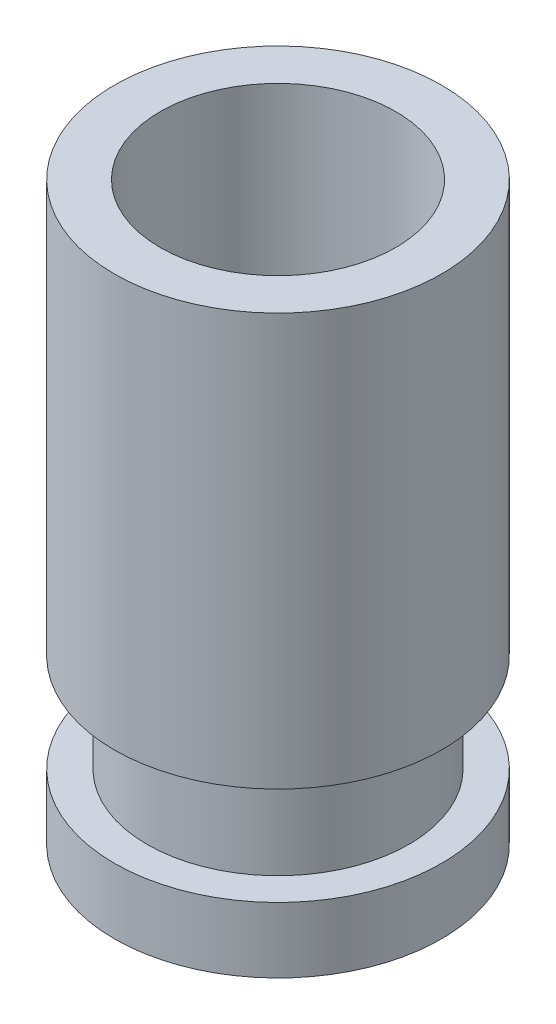
ISO-10303-21;
HEADER;
FILE_DESCRIPTION(('STEP AP214'),'2;1');
FILE_NAME('part.step','',(''),(''),'','','');
FILE_SCHEMA(('AUTOMOTIVE_DESIGN { 1 0 10303 214 1 1 1 1 }'));
ENDSEC;
DATA;
#1=APPLICATION_CONTEXT('core data for automotive mechanical design processes');
#2=APPLICATION_PROTOCOL_DEFINITION('international standard','automotive_design',2000,#1);
#3=PRODUCT_CONTEXT('',#1,'mechanical');
#4=PRODUCT('Part','Part','',(#3));
#5=PRODUCT_RELATED_PRODUCT_CATEGORY('part','',(#4));
#6=PRODUCT_DEFINITION_FORMATION('','',#4);
#7=PRODUCT_DEFINITION_CONTEXT('part definition',#1,'design');
#8=PRODUCT_DEFINITION('design','',#6,#7);
#9=PRODUCT_DEFINITION_SHAPE('','',#8);
#10=(LENGTH_UNIT() NAMED_UNIT(*) SI_UNIT(.MILLI.,.METRE.));
#11=(NAMED_UNIT(*) PLANE_ANGLE_UNIT() SI_UNIT($,.RADIAN.));
#12=(NAMED_UNIT(*) SI_UNIT($,.STERADIAN.) SOLID_ANGLE_UNIT());
#13=UNCERTAINTY_MEASURE_WITH_UNIT(LENGTH_MEASURE(1.E-05),#10,'distance_accuracy_value','');
#14=(GEOMETRIC_REPRESENTATION_CONTEXT(3) GLOBAL_UNCERTAINTY_ASSIGNED_CONTEXT((#13)) GLOBAL_UNIT_ASSIGNED_CONTEXT((#10,
#11,#12)) REPRESENTATION_CONTEXT('',''));
#15=CARTESIAN_POINT('',(0.,0.,0.));
#16=DIRECTION('',(0.,0.,1.));
#17=DIRECTION('',(1.,0.,0.));
#18=AXIS2_PLACEMENT_3D('',#15,#16,#17);
#19=CARTESIAN_POINT('',(0.,10.,0.));
#20=DIRECTION('',(0.,1.,0.));
#21=DIRECTION('',(0.,0.,1.));
#22=AXIS2_PLACEMENT_3D('',#19,#20,#21);
#23=PLANE('',#22);
#24=CARTESIAN_POINT('',(0.,10.,0.));
#25=DIRECTION('',(0.,1.,0.));
#26=DIRECTION('',(0.,0.,1.));
#27=AXIS2_PLACEMENT_3D('',#24,#25,#26);
#28=CIRCLE('',#27,25.);
#29=CARTESIAN_POINT('',(0.,10.,25.));
#30=VERTEX_POINT('',#29);
#31=EDGE_CURVE('E10',#30,#30,#28,.T.);
#32=ORIENTED_EDGE('',*,*,#31,.T.);
#33=EDGE_LOOP('',(#32));
#34=FACE_BOUND('',#33,.T.);
#35=CARTESIAN_POINT('',(0.,10.,0.));
#36=DIRECTION('',(0.,1.,0.));
#37=DIRECTION('',(0.,0.,1.));
#38=AXIS2_PLACEMENT_3D('',#35,#36,#37);
#39=CIRCLE('',#38,20.);
#40=CARTESIAN_POINT('',(0.,10.,20.));
#41=VERTEX_POINT('',#40);
#42=EDGE_CURVE('E47',#41,#41,#39,.T.);
#43=ORIENTED_EDGE('',*,*,#42,.F.);
#44=EDGE_LOOP('',(#43));
#45=FACE_BOUND('',#44,.T.);
#46=ADVANCED_FACE('F31',(#34,#45),#23,.T.);
#47=CARTESIAN_POINT('',(0.,0.,0.));
#48=DIRECTION('',(0.,1.,0.));
#49=DIRECTION('',(0.,0.,1.));
#50=AXIS2_PLACEMENT_3D('',#47,#48,#49);
#51=PLANE('',#50);
#52=CARTESIAN_POINT('',(0.,0.,0.));
#53=DIRECTION('',(0.,1.,0.));
#54=DIRECTION('',(0.,0.,1.));
#55=AXIS2_PLACEMENT_3D('',#52,#53,#54);
#56=CIRCLE('',#55,25.);
#57=CARTESIAN_POINT('',(0.,0.,25.));
#58=VERTEX_POINT('',#57);
#59=EDGE_CURVE('E35',#58,#58,#56,.T.);
#60=ORIENTED_EDGE('',*,*,#59,.F.);
#61=EDGE_LOOP('',(#60));
#62=FACE_BOUND('',#61,.T.);
#63=CARTESIAN_POINT('',(0.,0.,0.));
#64=DIRECTION('',(0.,1.,0.));
#65=DIRECTION('',(0.,0.,1.));
#66=AXIS2_PLACEMENT_3D('',#63,#64,#65);
#67=CIRCLE('',#66,18.);
#68=CARTESIAN_POINT('',(0.,0.,18.));
#69=VERTEX_POINT('',#68);
#70=EDGE_CURVE('E42',#69,#69,#67,.T.);
#71=ORIENTED_EDGE('',*,*,#70,.T.);
#72=EDGE_LOOP('',(#71));
#73=FACE_BOUND('',#72,.T.);
#74=ADVANCED_FACE('F80',(#62,#73),#51,.F.);
#75=CARTESIAN_POINT('',(0.,10.,0.));
#76=DIRECTION('',(0.,-1.,0.));
#77=DIRECTION('',(0.,0.,-1.));
#78=AXIS2_PLACEMENT_3D('',#75,#76,#77);
#79=CYLINDRICAL_SURFACE('',#78,25.);
#80=ORIENTED_EDGE('',*,*,#31,.F.);
#81=EDGE_LOOP('',(#80));
#82=FACE_BOUND('',#81,.T.);
#83=ORIENTED_EDGE('',*,*,#59,.T.);
#84=EDGE_LOOP('',(#83));
#85=FACE_BOUND('',#84,.T.);
#86=ADVANCED_FACE('F33',(#82,#85),#79,.T.);
#87=CARTESIAN_POINT('',(0.,10.,0.));
#88=DIRECTION('',(0.,-1.,0.));
#89=DIRECTION('',(0.,0.,-1.));
#90=AXIS2_PLACEMENT_3D('',#87,#88,#89);
#91=CYLINDRICAL_SURFACE('',#90,18.);
#92=ORIENTED_EDGE('',*,*,#70,.F.);
#93=EDGE_LOOP('',(#92));
#94=FACE_BOUND('',#93,.T.);
#95=CARTESIAN_POINT('',(0.,88.,0.));
#96=DIRECTION('',(0.,1.,0.));
#97=DIRECTION('',(0.,0.,1.));
#98=AXIS2_PLACEMENT_3D('',#95,#96,#97);
#99=CIRCLE('',#98,18.);
#100=CARTESIAN_POINT('',(0.,88.,18.));
#101=VERTEX_POINT('',#100);
#102=EDGE_CURVE('E56',#101,#101,#99,.T.);
#103=ORIENTED_EDGE('',*,*,#102,.T.);
#104=EDGE_LOOP('',(#103));
#105=FACE_BOUND('',#104,.T.);
#106=ADVANCED_FACE('F62',(#94,#105),#91,.F.);
#107=CARTESIAN_POINT('',(0.,25.,0.));
#108=DIRECTION('',(0.,-1.,0.));
#109=DIRECTION('',(0.,0.,-1.));
#110=AXIS2_PLACEMENT_3D('',#107,#108,#109);
#111=CYLINDRICAL_SURFACE('',#110,20.);
#112=CARTESIAN_POINT('',(0.,25.,0.));
#113=DIRECTION('',(0.,1.,0.));
#114=DIRECTION('',(0.,0.,1.));
#115=AXIS2_PLACEMENT_3D('',#112,#113,#114);
#116=CIRCLE('',#115,20.);
#117=CARTESIAN_POINT('',(0.,25.,20.));
#118=VERTEX_POINT('',#117);
#119=EDGE_CURVE('E46',#118,#118,#116,.T.);
#120=ORIENTED_EDGE('',*,*,#119,.F.);
#121=EDGE_LOOP('',(#120));
#122=FACE_BOUND('',#121,.T.);
#123=ORIENTED_EDGE('',*,*,#42,.T.);
#124=EDGE_LOOP('',(#123));
#125=FACE_BOUND('',#124,.T.);
#126=ADVANCED_FACE('F67',(#122,#125),#111,.T.);
#127=CARTESIAN_POINT('',(0.,88.,0.));
#128=DIRECTION('',(0.,1.,0.));
#129=DIRECTION('',(0.,0.,1.));
#130=AXIS2_PLACEMENT_3D('',#127,#128,#129);
#131=PLANE('',#130);
#132=CARTESIAN_POINT('',(0.,88.,0.));
#133=DIRECTION('',(0.,1.,0.));
#134=DIRECTION('',(0.,0.,1.));
#135=AXIS2_PLACEMENT_3D('',#132,#133,#134);
#136=CIRCLE('',#135,25.);
#137=CARTESIAN_POINT('',(0.,88.,25.));
#138=VERTEX_POINT('',#137);
#139=EDGE_CURVE('E50',#138,#138,#136,.T.);
#140=ORIENTED_EDGE('',*,*,#139,.T.);
#141=EDGE_LOOP('',(#140));
#142=FACE_BOUND('',#141,.T.);
#143=ORIENTED_EDGE('',*,*,#102,.F.);
#144=EDGE_LOOP('',(#143));
#145=FACE_BOUND('',#144,.T.);
#146=ADVANCED_FACE('F64',(#142,#145),#131,.T.);
#147=CARTESIAN_POINT('',(0.,25.,0.));
#148=DIRECTION('',(0.,1.,0.));
#149=DIRECTION('',(0.,0.,1.));
#150=AXIS2_PLACEMENT_3D('',#147,#148,#149);
#151=PLANE('',#150);
#152=ORIENTED_EDGE('',*,*,#119,.T.);
#153=EDGE_LOOP('',(#152));
#154=FACE_BOUND('',#153,.T.);
#155=CARTESIAN_POINT('',(0.,25.,0.));
#156=DIRECTION('',(0.,1.,0.));
#157=DIRECTION('',(0.,0.,1.));
#158=AXIS2_PLACEMENT_3D('',#155,#156,#157);
#159=CIRCLE('',#158,25.);
#160=CARTESIAN_POINT('',(0.,25.,25.));
#161=VERTEX_POINT('',#160);
#162=EDGE_CURVE('E53',#161,#161,#159,.T.);
#163=ORIENTED_EDGE('',*,*,#162,.F.);
#164=EDGE_LOOP('',(#163));
#165=FACE_BOUND('',#164,.T.);
#166=ADVANCED_FACE('F66',(#154,#165),#151,.F.);
#167=CARTESIAN_POINT('',(0.,88.,0.));
#168=DIRECTION('',(0.,-1.,0.));
#169=DIRECTION('',(0.,0.,-1.));
#170=AXIS2_PLACEMENT_3D('',#167,#168,#169);
#171=CYLINDRICAL_SURFACE('',#170,25.);
#172=ORIENTED_EDGE('',*,*,#139,.F.);
#173=EDGE_LOOP('',(#172));
#174=FACE_BOUND('',#173,.T.);
#175=ORIENTED_EDGE('',*,*,#162,.T.);
#176=EDGE_LOOP('',(#175));
#177=FACE_BOUND('',#176,.T.);
#178=ADVANCED_FACE('F74',(#174,#177),#171,.T.);
#179=CLOSED_SHELL('',(#46,#74,#86,#106,#126,#146,#166,#178));
#180=MANIFOLD_SOLID_BREP('B2',#179);
#181=ADVANCED_BREP_SHAPE_REPRESENTATION('',(#18,#180),#14);
#182=SHAPE_DEFINITION_REPRESENTATION(#9,#181);
ENDSEC;
END-ISO-10303-21;
